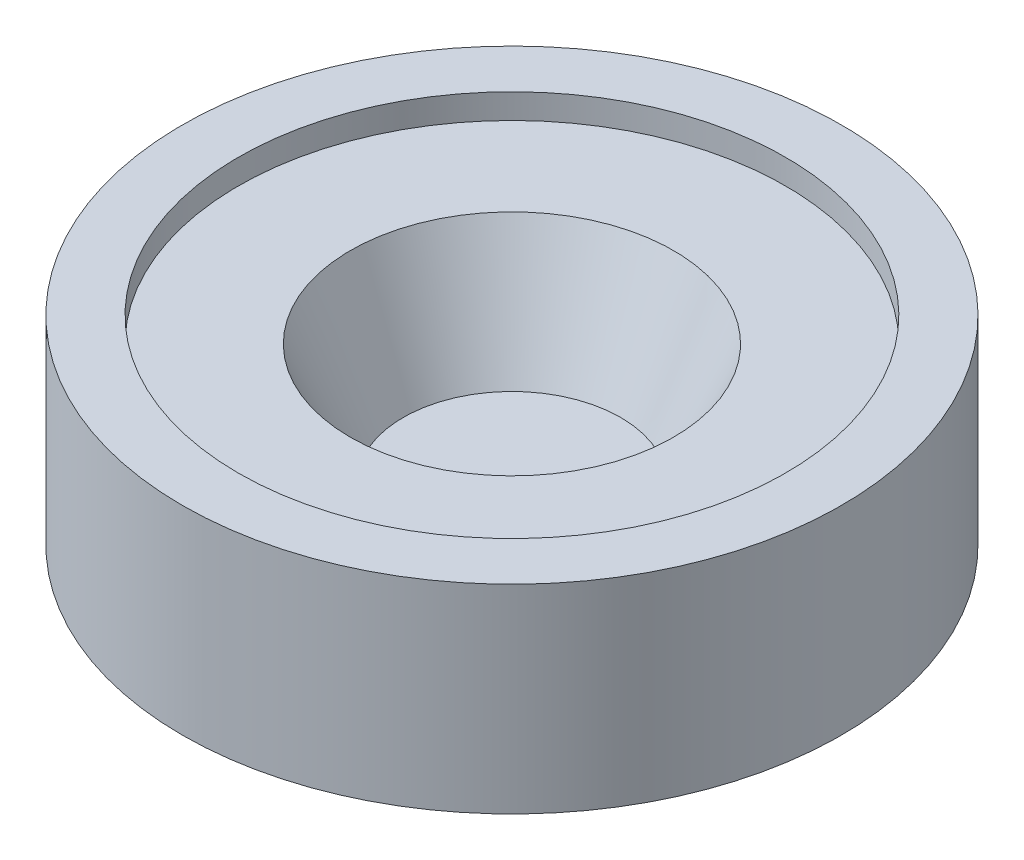
ISO-10303-21;
HEADER;
FILE_DESCRIPTION(('STEP AP214'),'2;1');
FILE_NAME('part.step','',(''),(''),'','','');
FILE_SCHEMA(('AUTOMOTIVE_DESIGN { 1 0 10303 214 1 1 1 1 }'));
ENDSEC;
DATA;
#1=APPLICATION_CONTEXT('core data for automotive mechanical design processes');
#2=APPLICATION_PROTOCOL_DEFINITION('international standard','automotive_design',2000,#1);
#3=PRODUCT_CONTEXT('',#1,'mechanical');
#4=PRODUCT('Part','Part','',(#3));
#5=PRODUCT_RELATED_PRODUCT_CATEGORY('part','',(#4));
#6=PRODUCT_DEFINITION_FORMATION('','',#4);
#7=PRODUCT_DEFINITION_CONTEXT('part definition',#1,'design');
#8=PRODUCT_DEFINITION('design','',#6,#7);
#9=PRODUCT_DEFINITION_SHAPE('','',#8);
#10=(LENGTH_UNIT() NAMED_UNIT(*) SI_UNIT(.MILLI.,.METRE.));
#11=(NAMED_UNIT(*) PLANE_ANGLE_UNIT() SI_UNIT($,.RADIAN.));
#12=(NAMED_UNIT(*) SI_UNIT($,.STERADIAN.) SOLID_ANGLE_UNIT());
#13=UNCERTAINTY_MEASURE_WITH_UNIT(LENGTH_MEASURE(1.E-05),#10,'distance_accuracy_value','');
#14=(GEOMETRIC_REPRESENTATION_CONTEXT(3) GLOBAL_UNCERTAINTY_ASSIGNED_CONTEXT((#13)) GLOBAL_UNIT_ASSIGNED_CONTEXT((#10,
#11,#12)) REPRESENTATION_CONTEXT('',''));
#15=CARTESIAN_POINT('',(0.,0.,0.));
#16=DIRECTION('',(0.,0.,1.));
#17=DIRECTION('',(1.,0.,0.));
#18=AXIS2_PLACEMENT_3D('',#15,#16,#17);
#19=CARTESIAN_POINT('',(-30.,-1.38575117136798,0.));
#20=DIRECTION('',(0.,-1.,0.));
#21=DIRECTION('',(0.,0.,-1.));
#22=AXIS2_PLACEMENT_3D('',#19,#20,#21);
#23=PLANE('',#22);
#24=CARTESIAN_POINT('',(0.,-1.38575117136798,0.));
#25=DIRECTION('',(0.,1.,0.));
#26=DIRECTION('',(0.,0.,1.));
#27=AXIS2_PLACEMENT_3D('',#24,#25,#26);
#28=CIRCLE('',#27,30.);
#29=CARTESIAN_POINT('',(0.,-1.38575117136798,30.));
#30=VERTEX_POINT('',#29);
#31=EDGE_CURVE('E37',#30,#30,#28,.F.);
#32=ORIENTED_EDGE('',*,*,#31,.T.);
#33=EDGE_LOOP('',(#32));
#34=FACE_BOUND('',#33,.T.);
#35=ADVANCED_FACE('F34',(#34),#23,.T.);
#36=CARTESIAN_POINT('',(0.,-7.38575117136798,0.));
#37=DIRECTION('',(0.,1.,0.));
#38=DIRECTION('',(0.,0.,1.));
#39=AXIS2_PLACEMENT_3D('',#36,#37,#38);
#40=CYLINDRICAL_SURFACE('',#39,30.);
#41=ORIENTED_EDGE('',*,*,#31,.F.);
#42=EDGE_LOOP('',(#41));
#43=FACE_BOUND('',#42,.T.);
#44=CARTESIAN_POINT('',(0.,-13.385751171368,0.));
#45=DIRECTION('',(0.,1.,0.));
#46=DIRECTION('',(0.,0.,1.));
#47=AXIS2_PLACEMENT_3D('',#44,#45,#46);
#48=CIRCLE('',#47,30.);
#49=CARTESIAN_POINT('',(0.,-13.385751171368,30.));
#50=VERTEX_POINT('',#49);
#51=EDGE_CURVE('E83',#50,#50,#48,.T.);
#52=ORIENTED_EDGE('',*,*,#51,.F.);
#53=EDGE_LOOP('',(#52));
#54=FACE_BOUND('',#53,.T.);
#55=ADVANCED_FACE('F91',(#43,#54),#40,.F.);
#56=CARTESIAN_POINT('',(-42.,-13.385751171368,0.));
#57=DIRECTION('',(0.,-1.,0.));
#58=DIRECTION('',(0.,0.,-1.));
#59=AXIS2_PLACEMENT_3D('',#56,#57,#58);
#60=PLANE('',#59);
#61=ORIENTED_EDGE('',*,*,#51,.T.);
#62=EDGE_LOOP('',(#61));
#63=FACE_BOUND('',#62,.T.);
#64=CARTESIAN_POINT('',(0.,-13.385751171368,0.));
#65=DIRECTION('',(0.,1.,0.));
#66=DIRECTION('',(0.,0.,1.));
#67=AXIS2_PLACEMENT_3D('',#64,#65,#66);
#68=CIRCLE('',#67,42.);
#69=CARTESIAN_POINT('',(0.,-13.385751171368,42.));
#70=VERTEX_POINT('',#69);
#71=EDGE_CURVE('E81',#70,#70,#68,.T.);
#72=ORIENTED_EDGE('',*,*,#71,.F.);
#73=EDGE_LOOP('',(#72));
#74=FACE_BOUND('',#73,.T.);
#75=ADVANCED_FACE('F94',(#63,#74),#60,.T.);
#76=CARTESIAN_POINT('',(0.,-11.885751171368,0.));
#77=DIRECTION('',(0.,1.,0.));
#78=DIRECTION('',(0.,0.,1.));
#79=AXIS2_PLACEMENT_3D('',#76,#77,#78);
#80=CYLINDRICAL_SURFACE('',#79,42.);
#81=ORIENTED_EDGE('',*,*,#71,.T.);
#82=EDGE_LOOP('',(#81));
#83=FACE_BOUND('',#82,.T.);
#84=CARTESIAN_POINT('',(0.,-10.385751171368,0.));
#85=DIRECTION('',(0.,1.,0.));
#86=DIRECTION('',(0.,0.,1.));
#87=AXIS2_PLACEMENT_3D('',#84,#85,#86);
#88=CIRCLE('',#87,42.);
#89=CARTESIAN_POINT('',(0.,-10.385751171368,42.));
#90=VERTEX_POINT('',#89);
#91=EDGE_CURVE('E78',#90,#90,#88,.T.);
#92=ORIENTED_EDGE('',*,*,#91,.F.);
#93=EDGE_LOOP('',(#92));
#94=FACE_BOUND('',#93,.T.);
#95=ADVANCED_FACE('F99',(#83,#94),#80,.T.);
#96=CARTESIAN_POINT('',(-48.75,-10.385751171368,0.));
#97=DIRECTION('',(0.,-1.,0.));
#98=DIRECTION('',(0.,0.,-1.));
#99=AXIS2_PLACEMENT_3D('',#96,#97,#98);
#100=PLANE('',#99);
#101=ORIENTED_EDGE('',*,*,#91,.T.);
#102=EDGE_LOOP('',(#101));
#103=FACE_BOUND('',#102,.T.);
#104=CARTESIAN_POINT('',(0.,-10.385751171368,0.));
#105=DIRECTION('',(0.,1.,0.));
#106=DIRECTION('',(0.,0.,1.));
#107=AXIS2_PLACEMENT_3D('',#104,#105,#106);
#108=CIRCLE('',#107,48.75);
#109=CARTESIAN_POINT('',(0.,-10.385751171368,48.75));
#110=VERTEX_POINT('',#109);
#111=EDGE_CURVE('E75',#110,#110,#108,.F.);
#112=ORIENTED_EDGE('',*,*,#111,.T.);
#113=EDGE_LOOP('',(#112));
#114=FACE_BOUND('',#113,.T.);
#115=ADVANCED_FACE('F151',(#103,#114),#100,.T.);
#116=CARTESIAN_POINT('',(0.,-11.885751171368,0.));
#117=DIRECTION('',(0.,1.,0.));
#118=DIRECTION('',(0.,0.,1.));
#119=AXIS2_PLACEMENT_3D('',#116,#117,#118);
#120=CYLINDRICAL_SURFACE('',#119,48.75);
#121=ORIENTED_EDGE('',*,*,#111,.F.);
#122=EDGE_LOOP('',(#121));
#123=FACE_BOUND('',#122,.T.);
#124=CARTESIAN_POINT('',(0.,-13.385751171368,0.));
#125=DIRECTION('',(0.,1.,0.));
#126=DIRECTION('',(0.,0.,1.));
#127=AXIS2_PLACEMENT_3D('',#124,#125,#126);
#128=CIRCLE('',#127,48.75);
#129=CARTESIAN_POINT('',(0.,-13.385751171368,48.75));
#130=VERTEX_POINT('',#129);
#131=EDGE_CURVE('E72',#130,#130,#128,.T.);
#132=ORIENTED_EDGE('',*,*,#131,.F.);
#133=EDGE_LOOP('',(#132));
#134=FACE_BOUND('',#133,.T.);
#135=ADVANCED_FACE('F147',(#123,#134),#120,.F.);
#136=CARTESIAN_POINT('',(0.,0.114248828632008,0.));
#137=DIRECTION('',(0.,1.,0.));
#138=DIRECTION('',(0.,0.,1.));
#139=AXIS2_PLACEMENT_3D('',#136,#137,#138);
#140=PLANE('',#139);
#141=CARTESIAN_POINT('',(0.,0.114248828640724,0.));
#142=DIRECTION('',(0.,1.,0.));
#143=DIRECTION('',(0.,0.,1.));
#144=AXIS2_PLACEMENT_3D('',#141,#142,#143);
#145=CIRCLE('',#144,26.2499999999805);
#146=CARTESIAN_POINT('',(0.,0.114248828640724,26.2499999999805));
#147=VERTEX_POINT('',#146);
#148=EDGE_CURVE('E69',#147,#147,#145,.T.);
#149=ORIENTED_EDGE('',*,*,#148,.T.);
#150=EDGE_LOOP('',(#149));
#151=FACE_BOUND('',#150,.T.);
#152=ADVANCED_FACE('F143',(#151),#140,.T.);
#153=CARTESIAN_POINT('',(-60.75,-13.385751171368,0.));
#154=DIRECTION('',(0.,-1.,0.));
#155=DIRECTION('',(0.,0.,-1.));
#156=AXIS2_PLACEMENT_3D('',#153,#154,#155);
#157=PLANE('',#156);
#158=ORIENTED_EDGE('',*,*,#131,.T.);
#159=EDGE_LOOP('',(#158));
#160=FACE_BOUND('',#159,.T.);
#161=CARTESIAN_POINT('',(0.,-13.385751171368,0.));
#162=DIRECTION('',(0.,1.,0.));
#163=DIRECTION('',(0.,0.,1.));
#164=AXIS2_PLACEMENT_3D('',#161,#162,#163);
#165=CIRCLE('',#164,60.75);
#166=CARTESIAN_POINT('',(0.,-13.385751171368,60.75));
#167=VERTEX_POINT('',#166);
#168=EDGE_CURVE('E66',#167,#167,#165,.T.);
#169=ORIENTED_EDGE('',*,*,#168,.F.);
#170=EDGE_LOOP('',(#169));
#171=FACE_BOUND('',#170,.T.);
#172=ADVANCED_FACE('F139',(#160,#171),#157,.T.);
#173=CARTESIAN_POINT('',(0.,28.6142488286233,0.));
#174=DIRECTION('',(0.,1.,0.));
#175=DIRECTION('',(0.,0.,1.));
#176=AXIS2_PLACEMENT_3D('',#173,#174,#175);
#177=CONICAL_SURFACE('',#176,39.0000000000195,0.420663349134401);
#178=CARTESIAN_POINT('',(0.,28.6142488286233,0.));
#179=DIRECTION('',(0.,1.,0.));
#180=DIRECTION('',(0.,0.,1.));
#181=AXIS2_PLACEMENT_3D('',#178,#179,#180);
#182=CIRCLE('',#181,39.0000000000195);
#183=CARTESIAN_POINT('',(0.,28.6142488286233,39.0000000000195));
#184=VERTEX_POINT('',#183);
#185=EDGE_CURVE('E63',#184,#184,#182,.F.);
#186=ORIENTED_EDGE('',*,*,#185,.F.);
#187=EDGE_LOOP('',(#186));
#188=FACE_BOUND('',#187,.T.);
#189=ORIENTED_EDGE('',*,*,#148,.F.);
#190=EDGE_LOOP('',(#189));
#191=FACE_BOUND('',#190,.T.);
#192=ADVANCED_FACE('F135',(#188,#191),#177,.F.);
#193=CARTESIAN_POINT('',(0.,-11.885751171368,0.));
#194=DIRECTION('',(0.,1.,0.));
#195=DIRECTION('',(0.,0.,1.));
#196=AXIS2_PLACEMENT_3D('',#193,#194,#195);
#197=CYLINDRICAL_SURFACE('',#196,60.75);
#198=ORIENTED_EDGE('',*,*,#168,.T.);
#199=EDGE_LOOP('',(#198));
#200=FACE_BOUND('',#199,.T.);
#201=CARTESIAN_POINT('',(0.,-10.385751171368,0.));
#202=DIRECTION('',(0.,1.,0.));
#203=DIRECTION('',(0.,0.,1.));
#204=AXIS2_PLACEMENT_3D('',#201,#202,#203);
#205=CIRCLE('',#204,60.75);
#206=CARTESIAN_POINT('',(0.,-10.385751171368,60.75));
#207=VERTEX_POINT('',#206);
#208=EDGE_CURVE('E60',#207,#207,#205,.T.);
#209=ORIENTED_EDGE('',*,*,#208,.F.);
#210=EDGE_LOOP('',(#209));
#211=FACE_BOUND('',#210,.T.);
#212=ADVANCED_FACE('F131',(#200,#211),#197,.T.);
#213=CARTESIAN_POINT('',(-39.,28.614248828632,0.));
#214=DIRECTION('',(0.,1.,0.));
#215=DIRECTION('',(0.,0.,1.));
#216=AXIS2_PLACEMENT_3D('',#213,#214,#215);
#217=PLANE('',#216);
#218=ORIENTED_EDGE('',*,*,#185,.T.);
#219=EDGE_LOOP('',(#218));
#220=FACE_BOUND('',#219,.T.);
#221=CARTESIAN_POINT('',(0.,28.614248828632,0.));
#222=DIRECTION('',(0.,1.,0.));
#223=DIRECTION('',(0.,0.,1.));
#224=AXIS2_PLACEMENT_3D('',#221,#222,#223);
#225=CIRCLE('',#224,66.);
#226=CARTESIAN_POINT('',(0.,28.614248828632,66.));
#227=VERTEX_POINT('',#226);
#228=EDGE_CURVE('E57',#227,#227,#225,.T.);
#229=ORIENTED_EDGE('',*,*,#228,.T.);
#230=EDGE_LOOP('',(#229));
#231=FACE_BOUND('',#230,.T.);
#232=ADVANCED_FACE('F127',(#220,#231),#217,.T.);
#233=CARTESIAN_POINT('',(-67.5,-10.385751171368,0.));
#234=DIRECTION('',(0.,-1.,0.));
#235=DIRECTION('',(0.,0.,-1.));
#236=AXIS2_PLACEMENT_3D('',#233,#234,#235);
#237=PLANE('',#236);
#238=ORIENTED_EDGE('',*,*,#208,.T.);
#239=EDGE_LOOP('',(#238));
#240=FACE_BOUND('',#239,.T.);
#241=CARTESIAN_POINT('',(0.,-10.385751171368,0.));
#242=DIRECTION('',(0.,1.,0.));
#243=DIRECTION('',(0.,0.,1.));
#244=AXIS2_PLACEMENT_3D('',#241,#242,#243);
#245=CIRCLE('',#244,67.5);
#246=CARTESIAN_POINT('',(0.,-10.385751171368,67.5));
#247=VERTEX_POINT('',#246);
#248=EDGE_CURVE('E54',#247,#247,#245,.F.);
#249=ORIENTED_EDGE('',*,*,#248,.T.);
#250=EDGE_LOOP('',(#249));
#251=FACE_BOUND('',#250,.T.);
#252=ADVANCED_FACE('F123',(#240,#251),#237,.T.);
#253=CARTESIAN_POINT('',(0.,31.614248828632,0.));
#254=DIRECTION('',(0.,1.,0.));
#255=DIRECTION('',(0.,0.,1.));
#256=AXIS2_PLACEMENT_3D('',#253,#254,#255);
#257=CYLINDRICAL_SURFACE('',#256,66.);
#258=CARTESIAN_POINT('',(0.,34.614248828632,0.));
#259=DIRECTION('',(0.,1.,0.));
#260=DIRECTION('',(0.,0.,1.));
#261=AXIS2_PLACEMENT_3D('',#258,#259,#260);
#262=CIRCLE('',#261,66.);
#263=CARTESIAN_POINT('',(0.,34.614248828632,66.));
#264=VERTEX_POINT('',#263);
#265=EDGE_CURVE('E51',#264,#264,#262,.F.);
#266=ORIENTED_EDGE('',*,*,#265,.F.);
#267=EDGE_LOOP('',(#266));
#268=FACE_BOUND('',#267,.T.);
#269=ORIENTED_EDGE('',*,*,#228,.F.);
#270=EDGE_LOOP('',(#269));
#271=FACE_BOUND('',#270,.T.);
#272=ADVANCED_FACE('F119',(#268,#271),#257,.F.);
#273=CARTESIAN_POINT('',(0.,-11.885751171368,0.));
#274=DIRECTION('',(0.,1.,0.));
#275=DIRECTION('',(0.,0.,1.));
#276=AXIS2_PLACEMENT_3D('',#273,#274,#275);
#277=CYLINDRICAL_SURFACE('',#276,67.5);
#278=ORIENTED_EDGE('',*,*,#248,.F.);
#279=EDGE_LOOP('',(#278));
#280=FACE_BOUND('',#279,.T.);
#281=CARTESIAN_POINT('',(0.,-13.385751171368,0.));
#282=DIRECTION('',(0.,1.,0.));
#283=DIRECTION('',(0.,0.,1.));
#284=AXIS2_PLACEMENT_3D('',#281,#282,#283);
#285=CIRCLE('',#284,67.5);
#286=CARTESIAN_POINT('',(0.,-13.385751171368,67.5));
#287=VERTEX_POINT('',#286);
#288=EDGE_CURVE('E46',#287,#287,#285,.T.);
#289=ORIENTED_EDGE('',*,*,#288,.F.);
#290=EDGE_LOOP('',(#289));
#291=FACE_BOUND('',#290,.T.);
#292=ADVANCED_FACE('F115',(#280,#291),#277,.F.);
#293=CARTESIAN_POINT('',(-66.,34.614248828632,0.));
#294=DIRECTION('',(0.,1.,0.));
#295=DIRECTION('',(0.,0.,1.));
#296=AXIS2_PLACEMENT_3D('',#293,#294,#295);
#297=PLANE('',#296);
#298=ORIENTED_EDGE('',*,*,#265,.T.);
#299=EDGE_LOOP('',(#298));
#300=FACE_BOUND('',#299,.T.);
#301=CARTESIAN_POINT('',(0.,34.614248828632,0.));
#302=DIRECTION('',(0.,1.,0.));
#303=DIRECTION('',(0.,0.,1.));
#304=AXIS2_PLACEMENT_3D('',#301,#302,#303);
#305=CIRCLE('',#304,79.5);
#306=CARTESIAN_POINT('',(0.,34.614248828632,79.5));
#307=VERTEX_POINT('',#306);
#308=EDGE_CURVE('E41',#307,#307,#305,.F.);
#309=ORIENTED_EDGE('',*,*,#308,.F.);
#310=EDGE_LOOP('',(#309));
#311=FACE_BOUND('',#310,.T.);
#312=ADVANCED_FACE('F108',(#300,#311),#297,.T.);
#313=CARTESIAN_POINT('',(-79.5,-13.385751171368,0.));
#314=DIRECTION('',(0.,-1.,0.));
#315=DIRECTION('',(0.,0.,-1.));
#316=AXIS2_PLACEMENT_3D('',#313,#314,#315);
#317=PLANE('',#316);
#318=ORIENTED_EDGE('',*,*,#288,.T.);
#319=EDGE_LOOP('',(#318));
#320=FACE_BOUND('',#319,.T.);
#321=CARTESIAN_POINT('',(0.,-13.385751171368,0.));
#322=DIRECTION('',(0.,1.,0.));
#323=DIRECTION('',(0.,0.,1.));
#324=AXIS2_PLACEMENT_3D('',#321,#322,#323);
#325=CIRCLE('',#324,79.5);
#326=CARTESIAN_POINT('',(0.,-13.385751171368,79.5));
#327=VERTEX_POINT('',#326);
#328=EDGE_CURVE('E10',#327,#327,#325,.T.);
#329=ORIENTED_EDGE('',*,*,#328,.F.);
#330=EDGE_LOOP('',(#329));
#331=FACE_BOUND('',#330,.T.);
#332=ADVANCED_FACE('F103',(#320,#331),#317,.T.);
#333=CARTESIAN_POINT('',(0.,10.614248828632,0.));
#334=DIRECTION('',(0.,1.,0.));
#335=DIRECTION('',(0.,0.,1.));
#336=AXIS2_PLACEMENT_3D('',#333,#334,#335);
#337=CYLINDRICAL_SURFACE('',#336,79.5);
#338=ORIENTED_EDGE('',*,*,#328,.T.);
#339=EDGE_LOOP('',(#338));
#340=FACE_BOUND('',#339,.T.);
#341=ORIENTED_EDGE('',*,*,#308,.T.);
#342=EDGE_LOOP('',(#341));
#343=FACE_BOUND('',#342,.T.);
#344=ADVANCED_FACE('F101',(#340,#343),#337,.T.);
#345=CLOSED_SHELL('',(#35,#55,#75,#95,#115,#135,#152,#172,#192,#212,#232,#252,#272,#292,#312,
#332,#344));
#346=MANIFOLD_SOLID_BREP('B2',#345);
#347=ADVANCED_BREP_SHAPE_REPRESENTATION('',(#18,#346),#14);
#348=SHAPE_DEFINITION_REPRESENTATION(#9,#347);
ENDSEC;
END-ISO-10303-21;
